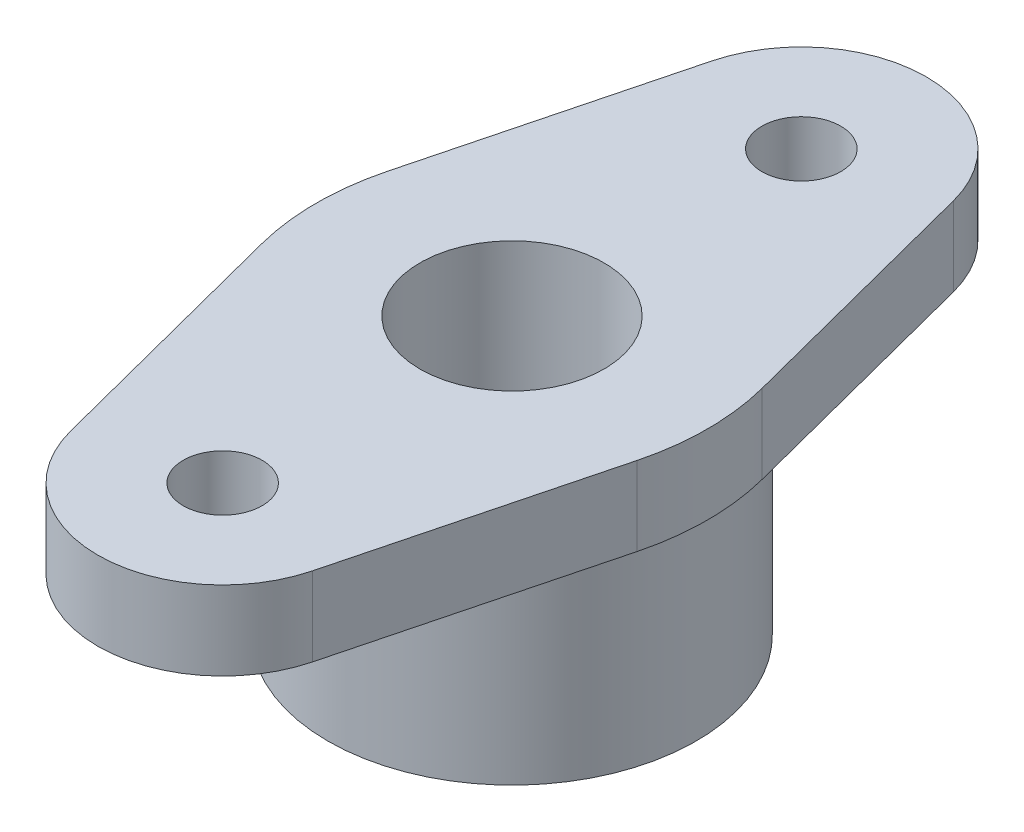
ISO-10303-21;
HEADER;
FILE_DESCRIPTION(('STEP AP214'),'2;1');
FILE_NAME('part.step','',(''),(''),'','','');
FILE_SCHEMA(('AUTOMOTIVE_DESIGN { 1 0 10303 214 1 1 1 1 }'));
ENDSEC;
DATA;
#1=APPLICATION_CONTEXT('core data for automotive mechanical design processes');
#2=APPLICATION_PROTOCOL_DEFINITION('international standard','automotive_design',2000,#1);
#3=PRODUCT_CONTEXT('',#1,'mechanical');
#4=PRODUCT('Part','Part','',(#3));
#5=PRODUCT_RELATED_PRODUCT_CATEGORY('part','',(#4));
#6=PRODUCT_DEFINITION_FORMATION('','',#4);
#7=PRODUCT_DEFINITION_CONTEXT('part definition',#1,'design');
#8=PRODUCT_DEFINITION('design','',#6,#7);
#9=PRODUCT_DEFINITION_SHAPE('','',#8);
#10=(LENGTH_UNIT() NAMED_UNIT(*) SI_UNIT(.MILLI.,.METRE.));
#11=(NAMED_UNIT(*) PLANE_ANGLE_UNIT() SI_UNIT($,.RADIAN.));
#12=(NAMED_UNIT(*) SI_UNIT($,.STERADIAN.) SOLID_ANGLE_UNIT());
#13=UNCERTAINTY_MEASURE_WITH_UNIT(LENGTH_MEASURE(1.E-05),#10,'distance_accuracy_value','');
#14=(GEOMETRIC_REPRESENTATION_CONTEXT(3) GLOBAL_UNCERTAINTY_ASSIGNED_CONTEXT((#13)) GLOBAL_UNIT_ASSIGNED_CONTEXT((#10,
#11,#12)) REPRESENTATION_CONTEXT('',''));
#15=CARTESIAN_POINT('',(0.,0.,0.));
#16=DIRECTION('',(0.,0.,1.));
#17=DIRECTION('',(1.,0.,0.));
#18=AXIS2_PLACEMENT_3D('',#15,#16,#17);
#19=CARTESIAN_POINT('',(-29.0578417959506,12.,7.51231827307483));
#20=DIRECTION('',(0.968168237112356,0.,-0.250300348874614));
#21=DIRECTION('',(-0.250300348874614,0.,-0.968168237112356));
#22=AXIS2_PLACEMENT_3D('',#19,#20,#21);
#23=PLANE('',#22);
#24=DIRECTION('',(0.250300348874614,0.,0.968168237112356));
#25=VECTOR('',#24,1.);
#26=CARTESIAN_POINT('',(-29.0578417959506,12.,7.51231827307483));
#27=LINE('',#26,#25);
#28=CARTESIAN_POINT('',(-28.54101615265,12.,9.51141325723534));
#29=VERTEX_POINT('',#28);
#30=CARTESIAN_POINT('',(-18.3951965051347,12.,48.7557066286177));
#31=VERTEX_POINT('',#30);
#32=EDGE_CURVE('E109',#29,#31,#27,.T.);
#33=ORIENTED_EDGE('',*,*,#32,.F.);
#34=DIRECTION('',(0.,-1.,0.));
#35=VECTOR('',#34,1.);
#36=CARTESIAN_POINT('',(-28.54101615265,12.,9.51141325723534));
#37=LINE('',#36,#35);
#38=CARTESIAN_POINT('',(-28.54101615265,0.,9.51141325723534));
#39=VERTEX_POINT('',#38);
#40=EDGE_CURVE('E132',#29,#39,#37,.T.);
#41=ORIENTED_EDGE('',*,*,#40,.T.);
#42=DIRECTION('',(0.250300348874614,0.,0.968168237112356));
#43=VECTOR('',#42,1.);
#44=CARTESIAN_POINT('',(-29.0578417959506,0.,7.51231827307483));
#45=LINE('',#44,#43);
#46=CARTESIAN_POINT('',(-18.3951965051347,0.,48.7557066286177));
#47=VERTEX_POINT('',#46);
#48=EDGE_CURVE('E127',#39,#47,#45,.T.);
#49=ORIENTED_EDGE('',*,*,#48,.T.);
#50=DIRECTION('',(0.,-1.,0.));
#51=VECTOR('',#50,1.);
#52=CARTESIAN_POINT('',(-18.3951965051347,12.,48.7557066286177));
#53=LINE('',#52,#51);
#54=EDGE_CURVE('E125',#31,#47,#53,.T.);
#55=ORIENTED_EDGE('',*,*,#54,.F.);
#56=EDGE_LOOP('',(#33,#41,#49,#55));
#57=FACE_BOUND('',#56,.T.);
#58=ADVANCED_FACE('F43',(#57),#23,.F.);
#59=CARTESIAN_POINT('',(0.,12.,44.));
#60=DIRECTION('',(0.,-1.,0.));
#61=DIRECTION('',(0.,0.,-1.));
#62=AXIS2_PLACEMENT_3D('',#59,#60,#61);
#63=CYLINDRICAL_SURFACE('',#62,19.);
#64=CARTESIAN_POINT('',(0.,0.,44.));
#65=DIRECTION('',(0.,1.,0.));
#66=DIRECTION('',(0.,0.,1.));
#67=AXIS2_PLACEMENT_3D('',#64,#65,#66);
#68=CIRCLE('',#67,19.);
#69=CARTESIAN_POINT('',(18.3951965051347,0.,48.7557066286177));
#70=VERTEX_POINT('',#69);
#71=EDGE_CURVE('E165',#70,#47,#68,.F.);
#72=ORIENTED_EDGE('',*,*,#71,.F.);
#73=DIRECTION('',(0.,-1.,0.));
#74=VECTOR('',#73,1.);
#75=CARTESIAN_POINT('',(18.3951965051347,12.,48.7557066286177));
#76=LINE('',#75,#74);
#77=CARTESIAN_POINT('',(18.3951965051347,12.,48.7557066286177));
#78=VERTEX_POINT('',#77);
#79=EDGE_CURVE('E133',#78,#70,#76,.T.);
#80=ORIENTED_EDGE('',*,*,#79,.F.);
#81=CARTESIAN_POINT('',(0.,12.,44.));
#82=DIRECTION('',(0.,1.,0.));
#83=DIRECTION('',(0.,0.,1.));
#84=AXIS2_PLACEMENT_3D('',#81,#82,#83);
#85=CIRCLE('',#84,19.);
#86=EDGE_CURVE('E115',#78,#31,#85,.F.);
#87=ORIENTED_EDGE('',*,*,#86,.T.);
#88=ORIENTED_EDGE('',*,*,#54,.T.);
#89=EDGE_LOOP('',(#72,#80,#87,#88));
#90=FACE_BOUND('',#89,.T.);
#91=ADVANCED_FACE('F136',(#90),#63,.T.);
#92=CARTESIAN_POINT('',(29.0578417959506,12.,7.51231827307483));
#93=DIRECTION('',(0.968168237112356,0.,0.250300348874614));
#94=DIRECTION('',(0.250300348874614,0.,-0.968168237112356));
#95=AXIS2_PLACEMENT_3D('',#92,#93,#94);
#96=PLANE('',#95);
#97=DIRECTION('',(-0.250300348874614,0.,0.968168237112356));
#98=VECTOR('',#97,1.);
#99=CARTESIAN_POINT('',(29.0578417959506,0.,7.51231827307483));
#100=LINE('',#99,#98);
#101=CARTESIAN_POINT('',(28.54101615265,0.,9.51141325723533));
#102=VERTEX_POINT('',#101);
#103=EDGE_CURVE('E169',#102,#70,#100,.T.);
#104=ORIENTED_EDGE('',*,*,#103,.F.);
#105=DIRECTION('',(0.,-1.,0.));
#106=VECTOR('',#105,1.);
#107=CARTESIAN_POINT('',(28.54101615265,12.,9.51141325723533));
#108=LINE('',#107,#106);
#109=CARTESIAN_POINT('',(28.54101615265,12.,9.51141325723533));
#110=VERTEX_POINT('',#109);
#111=EDGE_CURVE('E52',#102,#110,#108,.F.);
#112=ORIENTED_EDGE('',*,*,#111,.T.);
#113=DIRECTION('',(-0.250300348874614,0.,0.968168237112356));
#114=VECTOR('',#113,1.);
#115=CARTESIAN_POINT('',(29.0578417959506,12.,7.51231827307483));
#116=LINE('',#115,#114);
#117=EDGE_CURVE('E139',#110,#78,#116,.T.);
#118=ORIENTED_EDGE('',*,*,#117,.T.);
#119=ORIENTED_EDGE('',*,*,#79,.T.);
#120=EDGE_LOOP('',(#104,#112,#118,#119));
#121=FACE_BOUND('',#120,.T.);
#122=ADVANCED_FACE('F238',(#121),#96,.T.);
#123=CARTESIAN_POINT('',(29.0578417959506,12.,-7.51231827307483));
#124=DIRECTION('',(0.968168237112356,0.,-0.250300348874614));
#125=DIRECTION('',(-0.250300348874614,0.,-0.968168237112356));
#126=AXIS2_PLACEMENT_3D('',#123,#124,#125);
#127=PLANE('',#126);
#128=DIRECTION('',(0.250300348874614,0.,0.968168237112356));
#129=VECTOR('',#128,1.);
#130=CARTESIAN_POINT('',(29.0578417959506,12.,-7.51231827307483));
#131=LINE('',#130,#129);
#132=CARTESIAN_POINT('',(18.3951965051348,12.,-48.7557066286177));
#133=VERTEX_POINT('',#132);
#134=CARTESIAN_POINT('',(28.54101615265,12.,-9.51141325723535));
#135=VERTEX_POINT('',#134);
#136=EDGE_CURVE('E142',#133,#135,#131,.T.);
#137=ORIENTED_EDGE('',*,*,#136,.T.);
#138=DIRECTION('',(0.,-1.,0.));
#139=VECTOR('',#138,1.);
#140=CARTESIAN_POINT('',(28.54101615265,12.,-9.51141325723535));
#141=LINE('',#140,#139);
#142=CARTESIAN_POINT('',(28.54101615265,0.,-9.51141325723535));
#143=VERTEX_POINT('',#142);
#144=EDGE_CURVE('E214',#135,#143,#141,.T.);
#145=ORIENTED_EDGE('',*,*,#144,.T.);
#146=DIRECTION('',(0.250300348874614,0.,0.968168237112356));
#147=VECTOR('',#146,1.);
#148=CARTESIAN_POINT('',(29.0578417959506,0.,-7.51231827307483));
#149=LINE('',#148,#147);
#150=CARTESIAN_POINT('',(18.3951965051348,0.,-48.7557066286177));
#151=VERTEX_POINT('',#150);
#152=EDGE_CURVE('E172',#151,#143,#149,.T.);
#153=ORIENTED_EDGE('',*,*,#152,.F.);
#154=DIRECTION('',(0.,-1.,0.));
#155=VECTOR('',#154,1.);
#156=CARTESIAN_POINT('',(18.3951965051348,12.,-48.7557066286177));
#157=LINE('',#156,#155);
#158=EDGE_CURVE('E194',#133,#151,#157,.T.);
#159=ORIENTED_EDGE('',*,*,#158,.F.);
#160=EDGE_LOOP('',(#137,#145,#153,#159));
#161=FACE_BOUND('',#160,.T.);
#162=ADVANCED_FACE('F221',(#161),#127,.T.);
#163=CARTESIAN_POINT('',(0.,12.,-44.));
#164=DIRECTION('',(0.,-1.,0.));
#165=DIRECTION('',(0.,0.,-1.));
#166=AXIS2_PLACEMENT_3D('',#163,#164,#165);
#167=CYLINDRICAL_SURFACE('',#166,19.);
#168=CARTESIAN_POINT('',(0.,0.,-44.));
#169=DIRECTION('',(0.,1.,0.));
#170=DIRECTION('',(0.,0.,1.));
#171=AXIS2_PLACEMENT_3D('',#168,#169,#170);
#172=CIRCLE('',#171,19.);
#173=CARTESIAN_POINT('',(-18.3951965051348,0.,-48.7557066286177));
#174=VERTEX_POINT('',#173);
#175=EDGE_CURVE('E176',#151,#174,#172,.T.);
#176=ORIENTED_EDGE('',*,*,#175,.T.);
#177=DIRECTION('',(0.,-1.,0.));
#178=VECTOR('',#177,1.);
#179=CARTESIAN_POINT('',(-18.3951965051348,12.,-48.7557066286177));
#180=LINE('',#179,#178);
#181=CARTESIAN_POINT('',(-18.3951965051348,12.,-48.7557066286177));
#182=VERTEX_POINT('',#181);
#183=EDGE_CURVE('E162',#182,#174,#180,.T.);
#184=ORIENTED_EDGE('',*,*,#183,.F.);
#185=CARTESIAN_POINT('',(0.,12.,-44.));
#186=DIRECTION('',(0.,1.,0.));
#187=DIRECTION('',(0.,0.,1.));
#188=AXIS2_PLACEMENT_3D('',#185,#186,#187);
#189=CIRCLE('',#188,19.);
#190=EDGE_CURVE('E148',#133,#182,#189,.T.);
#191=ORIENTED_EDGE('',*,*,#190,.F.);
#192=ORIENTED_EDGE('',*,*,#158,.T.);
#193=EDGE_LOOP('',(#176,#184,#191,#192));
#194=FACE_BOUND('',#193,.T.);
#195=ADVANCED_FACE('F230',(#194),#167,.T.);
#196=CARTESIAN_POINT('',(0.,12.,-44.));
#197=DIRECTION('',(0.,-1.,0.));
#198=DIRECTION('',(0.,0.,-1.));
#199=AXIS2_PLACEMENT_3D('',#196,#197,#198);
#200=CYLINDRICAL_SURFACE('',#199,6.);
#201=CARTESIAN_POINT('',(0.,12.,-44.));
#202=DIRECTION('',(0.,1.,0.));
#203=DIRECTION('',(0.,0.,1.));
#204=AXIS2_PLACEMENT_3D('',#201,#202,#203);
#205=CIRCLE('',#204,6.);
#206=CARTESIAN_POINT('',(0.,12.,-38.));
#207=VERTEX_POINT('',#206);
#208=EDGE_CURVE('E154',#207,#207,#205,.T.);
#209=ORIENTED_EDGE('',*,*,#208,.T.);
#210=EDGE_LOOP('',(#209));
#211=FACE_BOUND('',#210,.T.);
#212=CARTESIAN_POINT('',(0.,0.,-44.));
#213=DIRECTION('',(0.,1.,0.));
#214=DIRECTION('',(0.,0.,1.));
#215=AXIS2_PLACEMENT_3D('',#212,#213,#214);
#216=CIRCLE('',#215,6.);
#217=CARTESIAN_POINT('',(0.,0.,-38.));
#218=VERTEX_POINT('',#217);
#219=EDGE_CURVE('E183',#218,#218,#216,.T.);
#220=ORIENTED_EDGE('',*,*,#219,.F.);
#221=EDGE_LOOP('',(#220));
#222=FACE_BOUND('',#221,.T.);
#223=ADVANCED_FACE('F266',(#211,#222),#200,.F.);
#224=CARTESIAN_POINT('',(-29.0578417959506,12.,-7.51231827307483));
#225=DIRECTION('',(0.968168237112356,0.,0.250300348874614));
#226=DIRECTION('',(0.250300348874614,0.,-0.968168237112356));
#227=AXIS2_PLACEMENT_3D('',#224,#225,#226);
#228=PLANE('',#227);
#229=DIRECTION('',(-0.250300348874614,0.,0.968168237112356));
#230=VECTOR('',#229,1.);
#231=CARTESIAN_POINT('',(-29.0578417959506,0.,-7.51231827307483));
#232=LINE('',#231,#230);
#233=CARTESIAN_POINT('',(-28.54101615265,0.,-9.51141325723534));
#234=VERTEX_POINT('',#233);
#235=EDGE_CURVE('E179',#174,#234,#232,.T.);
#236=ORIENTED_EDGE('',*,*,#235,.T.);
#237=DIRECTION('',(0.,-1.,0.));
#238=VECTOR('',#237,1.);
#239=CARTESIAN_POINT('',(-28.54101615265,12.,-9.51141325723534));
#240=LINE('',#239,#238);
#241=CARTESIAN_POINT('',(-28.54101615265,12.,-9.51141325723534));
#242=VERTEX_POINT('',#241);
#243=EDGE_CURVE('E207',#234,#242,#240,.F.);
#244=ORIENTED_EDGE('',*,*,#243,.T.);
#245=DIRECTION('',(-0.250300348874614,0.,0.968168237112356));
#246=VECTOR('',#245,1.);
#247=CARTESIAN_POINT('',(-29.0578417959506,12.,-7.51231827307483));
#248=LINE('',#247,#246);
#249=EDGE_CURVE('E151',#182,#242,#248,.T.);
#250=ORIENTED_EDGE('',*,*,#249,.F.);
#251=ORIENTED_EDGE('',*,*,#183,.T.);
#252=EDGE_LOOP('',(#236,#244,#250,#251));
#253=FACE_BOUND('',#252,.T.);
#254=ADVANCED_FACE('F234',(#253),#228,.F.);
#255=CARTESIAN_POINT('',(0.,12.,0.));
#256=DIRECTION('',(0.,-1.,0.));
#257=DIRECTION('',(0.,0.,-1.));
#258=AXIS2_PLACEMENT_3D('',#255,#256,#257);
#259=CYLINDRICAL_SURFACE('',#258,14.);
#260=CARTESIAN_POINT('',(0.,12.,0.));
#261=DIRECTION('',(0.,1.,0.));
#262=DIRECTION('',(0.,0.,1.));
#263=AXIS2_PLACEMENT_3D('',#260,#261,#262);
#264=CIRCLE('',#263,14.);
#265=CARTESIAN_POINT('',(0.,12.,14.));
#266=VERTEX_POINT('',#265);
#267=EDGE_CURVE('E122',#266,#266,#264,.T.);
#268=ORIENTED_EDGE('',*,*,#267,.T.);
#269=EDGE_LOOP('',(#268));
#270=FACE_BOUND('',#269,.T.);
#271=CARTESIAN_POINT('',(0.,-21.9170962313453,0.));
#272=DIRECTION('',(0.,1.,0.));
#273=DIRECTION('',(0.,0.,1.));
#274=AXIS2_PLACEMENT_3D('',#271,#272,#273);
#275=CIRCLE('',#274,14.);
#276=CARTESIAN_POINT('',(0.,-21.9170962313453,14.));
#277=VERTEX_POINT('',#276);
#278=EDGE_CURVE('E166',#277,#277,#275,.T.);
#279=ORIENTED_EDGE('',*,*,#278,.F.);
#280=EDGE_LOOP('',(#279));
#281=FACE_BOUND('',#280,.T.);
#282=ADVANCED_FACE('F256',(#270,#281),#259,.F.);
#283=CARTESIAN_POINT('',(0.,12.,44.));
#284=DIRECTION('',(0.,-1.,0.));
#285=DIRECTION('',(0.,0.,-1.));
#286=AXIS2_PLACEMENT_3D('',#283,#284,#285);
#287=CYLINDRICAL_SURFACE('',#286,6.);
#288=CARTESIAN_POINT('',(0.,12.,44.));
#289=DIRECTION('',(0.,1.,0.));
#290=DIRECTION('',(0.,0.,1.));
#291=AXIS2_PLACEMENT_3D('',#288,#289,#290);
#292=CIRCLE('',#291,6.);
#293=CARTESIAN_POINT('',(0.,12.,50.));
#294=VERTEX_POINT('',#293);
#295=EDGE_CURVE('E158',#294,#294,#292,.F.);
#296=ORIENTED_EDGE('',*,*,#295,.F.);
#297=EDGE_LOOP('',(#296));
#298=FACE_BOUND('',#297,.T.);
#299=CARTESIAN_POINT('',(0.,0.,44.));
#300=DIRECTION('',(0.,1.,0.));
#301=DIRECTION('',(0.,0.,1.));
#302=AXIS2_PLACEMENT_3D('',#299,#300,#301);
#303=CIRCLE('',#302,6.);
#304=CARTESIAN_POINT('',(0.,0.,50.));
#305=VERTEX_POINT('',#304);
#306=EDGE_CURVE('E187',#305,#305,#303,.F.);
#307=ORIENTED_EDGE('',*,*,#306,.T.);
#308=EDGE_LOOP('',(#307));
#309=FACE_BOUND('',#308,.T.);
#310=ADVANCED_FACE('F258',(#298,#309),#287,.F.);
#311=CARTESIAN_POINT('',(0.,12.,0.));
#312=DIRECTION('',(0.,1.,0.));
#313=DIRECTION('',(0.,0.,1.));
#314=AXIS2_PLACEMENT_3D('',#311,#312,#313);
#315=PLANE('',#314);
#316=ORIENTED_EDGE('',*,*,#267,.F.);
#317=EDGE_LOOP('',(#316));
#318=FACE_BOUND('',#317,.T.);
#319=ORIENTED_EDGE('',*,*,#249,.T.);
#320=CARTESIAN_POINT('',(8.24937685761954,12.,0.));
#321=DIRECTION('',(0.,1.,0.));
#322=DIRECTION('',(0.,0.,1.));
#323=AXIS2_PLACEMENT_3D('',#320,#321,#322);
#324=CIRCLE('',#323,38.);
#325=EDGE_CURVE('E117',#242,#29,#324,.T.);
#326=ORIENTED_EDGE('',*,*,#325,.T.);
#327=ORIENTED_EDGE('',*,*,#32,.T.);
#328=ORIENTED_EDGE('',*,*,#86,.F.);
#329=ORIENTED_EDGE('',*,*,#117,.F.);
#330=CARTESIAN_POINT('',(-8.24937685761954,12.,0.));
#331=DIRECTION('',(0.,1.,0.));
#332=DIRECTION('',(0.,0.,1.));
#333=AXIS2_PLACEMENT_3D('',#330,#331,#332);
#334=CIRCLE('',#333,38.);
#335=EDGE_CURVE('E59',#110,#135,#334,.T.);
#336=ORIENTED_EDGE('',*,*,#335,.T.);
#337=ORIENTED_EDGE('',*,*,#136,.F.);
#338=ORIENTED_EDGE('',*,*,#190,.T.);
#339=EDGE_LOOP('',(#319,#326,#327,#328,#329,#336,#337,#338));
#340=FACE_BOUND('',#339,.T.);
#341=ORIENTED_EDGE('',*,*,#208,.F.);
#342=EDGE_LOOP('',(#341));
#343=FACE_BOUND('',#342,.T.);
#344=ORIENTED_EDGE('',*,*,#295,.T.);
#345=EDGE_LOOP('',(#344));
#346=FACE_BOUND('',#345,.T.);
#347=ADVANCED_FACE('F112',(#318,#340,#343,#346),#315,.T.);
#348=CARTESIAN_POINT('',(0.,0.,0.));
#349=DIRECTION('',(0.,1.,0.));
#350=DIRECTION('',(0.,0.,1.));
#351=AXIS2_PLACEMENT_3D('',#348,#349,#350);
#352=PLANE('',#351);
#353=CARTESIAN_POINT('',(0.,0.,0.));
#354=DIRECTION('',(0.,1.,0.));
#355=DIRECTION('',(0.,0.,1.));
#356=AXIS2_PLACEMENT_3D('',#353,#354,#355);
#357=CIRCLE('',#356,28.);
#358=CARTESIAN_POINT('',(0.,0.,28.));
#359=VERTEX_POINT('',#358);
#360=EDGE_CURVE('E11',#359,#359,#357,.F.);
#361=ORIENTED_EDGE('',*,*,#360,.F.);
#362=EDGE_LOOP('',(#361));
#363=FACE_BOUND('',#362,.T.);
#364=ORIENTED_EDGE('',*,*,#48,.F.);
#365=CARTESIAN_POINT('',(8.24937685761954,0.,0.));
#366=DIRECTION('',(0.,1.,0.));
#367=DIRECTION('',(0.,0.,1.));
#368=AXIS2_PLACEMENT_3D('',#365,#366,#367);
#369=CIRCLE('',#368,38.);
#370=EDGE_CURVE('E204',#39,#234,#369,.F.);
#371=ORIENTED_EDGE('',*,*,#370,.T.);
#372=ORIENTED_EDGE('',*,*,#235,.F.);
#373=ORIENTED_EDGE('',*,*,#175,.F.);
#374=ORIENTED_EDGE('',*,*,#152,.T.);
#375=CARTESIAN_POINT('',(-8.24937685761954,0.,0.));
#376=DIRECTION('',(0.,1.,0.));
#377=DIRECTION('',(0.,0.,1.));
#378=AXIS2_PLACEMENT_3D('',#375,#376,#377);
#379=CIRCLE('',#378,38.);
#380=EDGE_CURVE('E201',#143,#102,#379,.F.);
#381=ORIENTED_EDGE('',*,*,#380,.T.);
#382=ORIENTED_EDGE('',*,*,#103,.T.);
#383=ORIENTED_EDGE('',*,*,#71,.T.);
#384=EDGE_LOOP('',(#364,#371,#372,#373,#374,#381,#382,#383));
#385=FACE_BOUND('',#384,.T.);
#386=ORIENTED_EDGE('',*,*,#219,.T.);
#387=EDGE_LOOP('',(#386));
#388=FACE_BOUND('',#387,.T.);
#389=ORIENTED_EDGE('',*,*,#306,.F.);
#390=EDGE_LOOP('',(#389));
#391=FACE_BOUND('',#390,.T.);
#392=ADVANCED_FACE('F225',(#363,#385,#388,#391),#352,.F.);
#393=CARTESIAN_POINT('',(8.24937685761954,12.,0.));
#394=DIRECTION('',(0.,-1.,0.));
#395=DIRECTION('',(0.,0.,-1.));
#396=AXIS2_PLACEMENT_3D('',#393,#394,#395);
#397=CYLINDRICAL_SURFACE('',#396,38.);
#398=ORIENTED_EDGE('',*,*,#325,.F.);
#399=ORIENTED_EDGE('',*,*,#243,.F.);
#400=ORIENTED_EDGE('',*,*,#370,.F.);
#401=ORIENTED_EDGE('',*,*,#40,.F.);
#402=EDGE_LOOP('',(#398,#399,#400,#401));
#403=FACE_BOUND('',#402,.T.);
#404=ADVANCED_FACE('F237',(#403),#397,.T.);
#405=CARTESIAN_POINT('',(-8.24937685761954,12.,0.));
#406=DIRECTION('',(0.,-1.,0.));
#407=DIRECTION('',(0.,0.,-1.));
#408=AXIS2_PLACEMENT_3D('',#405,#406,#407);
#409=CYLINDRICAL_SURFACE('',#408,38.);
#410=ORIENTED_EDGE('',*,*,#335,.F.);
#411=ORIENTED_EDGE('',*,*,#111,.F.);
#412=ORIENTED_EDGE('',*,*,#380,.F.);
#413=ORIENTED_EDGE('',*,*,#144,.F.);
#414=EDGE_LOOP('',(#410,#411,#412,#413));
#415=FACE_BOUND('',#414,.T.);
#416=ADVANCED_FACE('F45',(#415),#409,.T.);
#417=CARTESIAN_POINT('',(0.,-21.9170962313453,0.));
#418=DIRECTION('',(0.,-1.,0.));
#419=DIRECTION('',(0.,0.,-1.));
#420=AXIS2_PLACEMENT_3D('',#417,#418,#419);
#421=CONICAL_SURFACE('',#420,14.,1.0471975511966);
#422=CARTESIAN_POINT('',(0.,-30.,0.));
#423=DIRECTION('',(0.,1.,0.));
#424=DIRECTION('',(0.,0.,1.));
#425=AXIS2_PLACEMENT_3D('',#422,#423,#424);
#426=CIRCLE('',#425,28.);
#427=CARTESIAN_POINT('',(0.,-30.,28.));
#428=VERTEX_POINT('',#427);
#429=EDGE_CURVE('E275',#428,#428,#426,.T.);
#430=ORIENTED_EDGE('',*,*,#429,.F.);
#431=EDGE_LOOP('',(#430));
#432=FACE_BOUND('',#431,.T.);
#433=ORIENTED_EDGE('',*,*,#278,.T.);
#434=EDGE_LOOP('',(#433));
#435=FACE_BOUND('',#434,.T.);
#436=ADVANCED_FACE('F240',(#432,#435),#421,.F.);
#437=CARTESIAN_POINT('',(0.,0.,0.));
#438=DIRECTION('',(0.,1.,0.));
#439=DIRECTION('',(0.,0.,1.));
#440=AXIS2_PLACEMENT_3D('',#437,#438,#439);
#441=CYLINDRICAL_SURFACE('',#440,28.);
#442=ORIENTED_EDGE('',*,*,#360,.T.);
#443=EDGE_LOOP('',(#442));
#444=FACE_BOUND('',#443,.T.);
#445=ORIENTED_EDGE('',*,*,#429,.T.);
#446=EDGE_LOOP('',(#445));
#447=FACE_BOUND('',#446,.T.);
#448=ADVANCED_FACE('F245',(#444,#447),#441,.T.);
#449=CLOSED_SHELL('',(#58,#91,#122,#162,#195,#223,#254,#282,#310,#347,#392,#404,#416,#436,#448));
#450=MANIFOLD_SOLID_BREP('B2',#449);
#451=ADVANCED_BREP_SHAPE_REPRESENTATION('',(#18,#450),#14);
#452=SHAPE_DEFINITION_REPRESENTATION(#9,#451);
ENDSEC;
END-ISO-10303-21;
